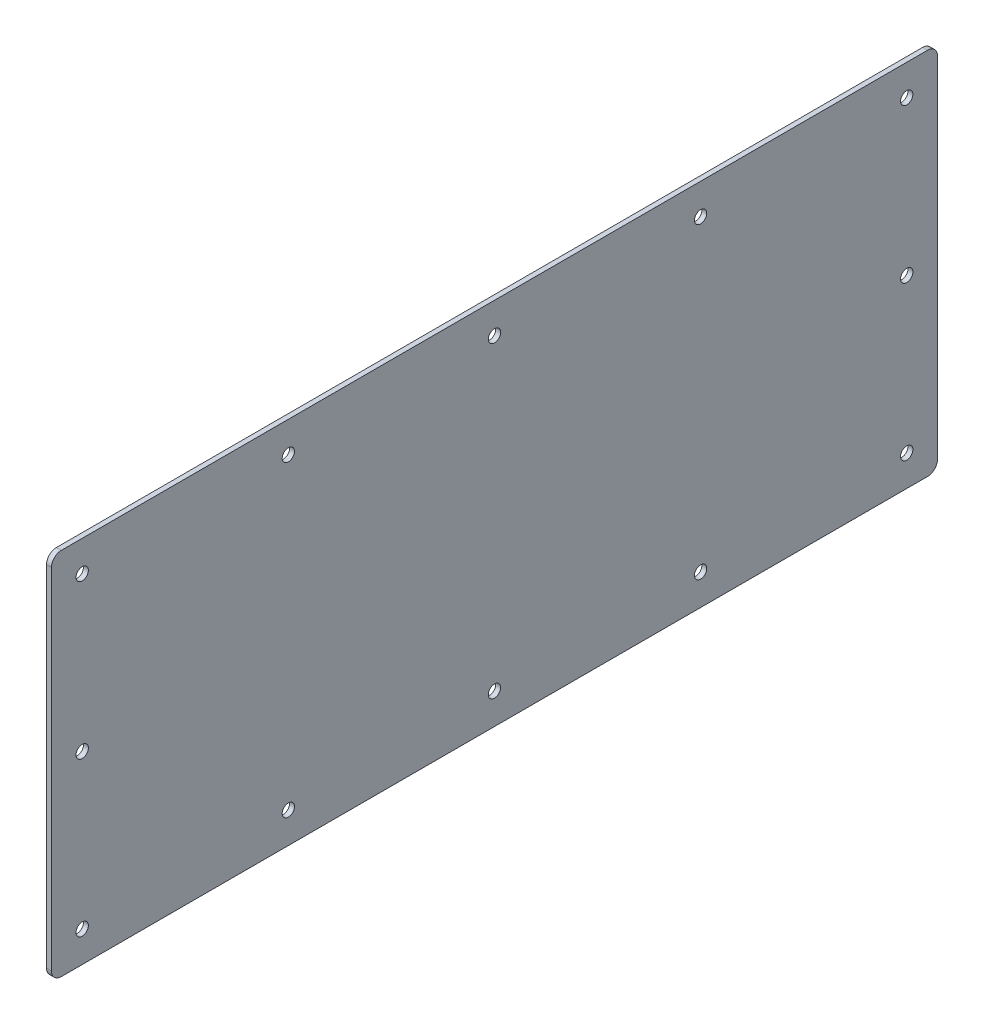
ISO-10303-21;
HEADER;
FILE_DESCRIPTION(('STEP AP214'),'2;1');
FILE_NAME('part.step','',(''),(''),'','','');
FILE_SCHEMA(('AUTOMOTIVE_DESIGN { 1 0 10303 214 1 1 1 1 }'));
ENDSEC;
DATA;
#1=APPLICATION_CONTEXT('core data for automotive mechanical design processes');
#2=APPLICATION_PROTOCOL_DEFINITION('international standard','automotive_design',2000,#1);
#3=PRODUCT_CONTEXT('',#1,'mechanical');
#4=PRODUCT('Part','Part','',(#3));
#5=PRODUCT_RELATED_PRODUCT_CATEGORY('part','',(#4));
#6=PRODUCT_DEFINITION_FORMATION('','',#4);
#7=PRODUCT_DEFINITION_CONTEXT('part definition',#1,'design');
#8=PRODUCT_DEFINITION('design','',#6,#7);
#9=PRODUCT_DEFINITION_SHAPE('','',#8);
#10=(LENGTH_UNIT() NAMED_UNIT(*) SI_UNIT(.MILLI.,.METRE.));
#11=(NAMED_UNIT(*) PLANE_ANGLE_UNIT() SI_UNIT($,.RADIAN.));
#12=(NAMED_UNIT(*) SI_UNIT($,.STERADIAN.) SOLID_ANGLE_UNIT());
#13=UNCERTAINTY_MEASURE_WITH_UNIT(LENGTH_MEASURE(1.E-05),#10,'distance_accuracy_value','');
#14=(GEOMETRIC_REPRESENTATION_CONTEXT(3) GLOBAL_UNCERTAINTY_ASSIGNED_CONTEXT((#13)) GLOBAL_UNIT_ASSIGNED_CONTEXT((#10,
#11,#12)) REPRESENTATION_CONTEXT('',''));
#15=CARTESIAN_POINT('',(0.,0.,0.));
#16=DIRECTION('',(0.,0.,1.));
#17=DIRECTION('',(1.,0.,0.));
#18=AXIS2_PLACEMENT_3D('',#15,#16,#17);
#19=CARTESIAN_POINT('',(2.54,95.25,-228.6));
#20=DIRECTION('',(0.,-1.,0.));
#21=DIRECTION('',(0.,0.,-1.));
#22=AXIS2_PLACEMENT_3D('',#19,#20,#21);
#23=PLANE('',#22);
#24=DIRECTION('',(0.,0.,1.));
#25=VECTOR('',#24,1.);
#26=CARTESIAN_POINT('',(2.54,95.25,-228.6));
#27=LINE('',#26,#25);
#28=CARTESIAN_POINT('',(2.54,95.25,-223.52));
#29=VERTEX_POINT('',#28);
#30=CARTESIAN_POINT('',(2.54,95.25,223.52));
#31=VERTEX_POINT('',#30);
#32=EDGE_CURVE('E132',#29,#31,#27,.T.);
#33=ORIENTED_EDGE('',*,*,#32,.F.);
#34=DIRECTION('',(-1.,0.,0.));
#35=VECTOR('',#34,1.);
#36=CARTESIAN_POINT('',(2.54,95.25,-223.52));
#37=LINE('',#36,#35);
#38=CARTESIAN_POINT('',(0.,95.25,-223.52));
#39=VERTEX_POINT('',#38);
#40=EDGE_CURVE('E117',#29,#39,#37,.T.);
#41=ORIENTED_EDGE('',*,*,#40,.T.);
#42=DIRECTION('',(0.,0.,1.));
#43=VECTOR('',#42,1.);
#44=CARTESIAN_POINT('',(0.,95.25,-228.6));
#45=LINE('',#44,#43);
#46=CARTESIAN_POINT('',(0.,95.25,223.52));
#47=VERTEX_POINT('',#46);
#48=EDGE_CURVE('E129',#39,#47,#45,.T.);
#49=ORIENTED_EDGE('',*,*,#48,.T.);
#50=DIRECTION('',(-1.,0.,0.));
#51=VECTOR('',#50,1.);
#52=CARTESIAN_POINT('',(2.54,95.25,223.52));
#53=LINE('',#52,#51);
#54=EDGE_CURVE('E134',#47,#31,#53,.F.);
#55=ORIENTED_EDGE('',*,*,#54,.T.);
#56=EDGE_LOOP('',(#33,#41,#49,#55));
#57=FACE_BOUND('',#56,.T.);
#58=ADVANCED_FACE('F45',(#57),#23,.F.);
#59=CARTESIAN_POINT('',(2.54,-95.25,228.6));
#60=DIRECTION('',(0.,0.,-1.));
#61=DIRECTION('',(-1.,0.,0.));
#62=AXIS2_PLACEMENT_3D('',#59,#60,#61);
#63=PLANE('',#62);
#64=DIRECTION('',(0.,-1.,0.));
#65=VECTOR('',#64,1.);
#66=CARTESIAN_POINT('',(0.,-95.25,228.6));
#67=LINE('',#66,#65);
#68=CARTESIAN_POINT('',(0.,90.17,228.6));
#69=VERTEX_POINT('',#68);
#70=CARTESIAN_POINT('',(0.,-90.17,228.6));
#71=VERTEX_POINT('',#70);
#72=EDGE_CURVE('E138',#69,#71,#67,.T.);
#73=ORIENTED_EDGE('',*,*,#72,.T.);
#74=DIRECTION('',(-1.,0.,0.));
#75=VECTOR('',#74,1.);
#76=CARTESIAN_POINT('',(2.54,-90.17,228.6));
#77=LINE('',#76,#75);
#78=CARTESIAN_POINT('',(2.54,-90.17,228.6));
#79=VERTEX_POINT('',#78);
#80=EDGE_CURVE('E11',#71,#79,#77,.F.);
#81=ORIENTED_EDGE('',*,*,#80,.T.);
#82=DIRECTION('',(0.,-1.,0.));
#83=VECTOR('',#82,1.);
#84=CARTESIAN_POINT('',(2.54,-95.25,228.6));
#85=LINE('',#84,#83);
#86=CARTESIAN_POINT('',(2.54,90.17,228.6));
#87=VERTEX_POINT('',#86);
#88=EDGE_CURVE('E278',#87,#79,#85,.T.);
#89=ORIENTED_EDGE('',*,*,#88,.F.);
#90=DIRECTION('',(-1.,0.,0.));
#91=VECTOR('',#90,1.);
#92=CARTESIAN_POINT('',(2.54,90.17,228.6));
#93=LINE('',#92,#91);
#94=EDGE_CURVE('E54',#87,#69,#93,.T.);
#95=ORIENTED_EDGE('',*,*,#94,.T.);
#96=EDGE_LOOP('',(#73,#81,#89,#95));
#97=FACE_BOUND('',#96,.T.);
#98=ADVANCED_FACE('F295',(#97),#63,.F.);
#99=CARTESIAN_POINT('',(2.54,-95.25,-228.6));
#100=DIRECTION('',(0.,1.,0.));
#101=DIRECTION('',(0.,0.,1.));
#102=AXIS2_PLACEMENT_3D('',#99,#100,#101);
#103=PLANE('',#102);
#104=DIRECTION('',(0.,0.,-1.));
#105=VECTOR('',#104,1.);
#106=CARTESIAN_POINT('',(0.,-95.25,-228.6));
#107=LINE('',#106,#105);
#108=CARTESIAN_POINT('',(0.,-95.25,223.52));
#109=VERTEX_POINT('',#108);
#110=CARTESIAN_POINT('',(0.,-95.25,-223.52));
#111=VERTEX_POINT('',#110);
#112=EDGE_CURVE('E141',#109,#111,#107,.T.);
#113=ORIENTED_EDGE('',*,*,#112,.T.);
#114=DIRECTION('',(-1.,0.,0.));
#115=VECTOR('',#114,1.);
#116=CARTESIAN_POINT('',(2.54,-95.25,-223.52));
#117=LINE('',#116,#115);
#118=CARTESIAN_POINT('',(2.54,-95.25,-223.52));
#119=VERTEX_POINT('',#118);
#120=EDGE_CURVE('E62',#111,#119,#117,.F.);
#121=ORIENTED_EDGE('',*,*,#120,.T.);
#122=DIRECTION('',(0.,0.,-1.));
#123=VECTOR('',#122,1.);
#124=CARTESIAN_POINT('',(2.54,-95.25,-228.6));
#125=LINE('',#124,#123);
#126=CARTESIAN_POINT('',(2.54,-95.25,223.52));
#127=VERTEX_POINT('',#126);
#128=EDGE_CURVE('E279',#127,#119,#125,.T.);
#129=ORIENTED_EDGE('',*,*,#128,.F.);
#130=DIRECTION('',(-1.,0.,0.));
#131=VECTOR('',#130,1.);
#132=CARTESIAN_POINT('',(2.54,-95.25,223.52));
#133=LINE('',#132,#131);
#134=EDGE_CURVE('E167',#127,#109,#133,.T.);
#135=ORIENTED_EDGE('',*,*,#134,.T.);
#136=EDGE_LOOP('',(#113,#121,#129,#135));
#137=FACE_BOUND('',#136,.T.);
#138=ADVANCED_FACE('F289',(#137),#103,.F.);
#139=CARTESIAN_POINT('',(2.54,-95.25,-228.6));
#140=DIRECTION('',(0.,0.,1.));
#141=DIRECTION('',(1.,0.,0.));
#142=AXIS2_PLACEMENT_3D('',#139,#140,#141);
#143=PLANE('',#142);
#144=DIRECTION('',(0.,1.,0.));
#145=VECTOR('',#144,1.);
#146=CARTESIAN_POINT('',(0.,-95.25,-228.6));
#147=LINE('',#146,#145);
#148=CARTESIAN_POINT('',(0.,-90.17,-228.6));
#149=VERTEX_POINT('',#148);
#150=CARTESIAN_POINT('',(0.,90.17,-228.6));
#151=VERTEX_POINT('',#150);
#152=EDGE_CURVE('E150',#149,#151,#147,.T.);
#153=ORIENTED_EDGE('',*,*,#152,.T.);
#154=DIRECTION('',(-1.,0.,0.));
#155=VECTOR('',#154,1.);
#156=CARTESIAN_POINT('',(2.54,90.17,-228.6));
#157=LINE('',#156,#155);
#158=CARTESIAN_POINT('',(2.54,90.17,-228.6));
#159=VERTEX_POINT('',#158);
#160=EDGE_CURVE('E118',#151,#159,#157,.F.);
#161=ORIENTED_EDGE('',*,*,#160,.T.);
#162=DIRECTION('',(0.,1.,0.));
#163=VECTOR('',#162,1.);
#164=CARTESIAN_POINT('',(2.54,-95.25,-228.6));
#165=LINE('',#164,#163);
#166=CARTESIAN_POINT('',(2.54,-90.17,-228.6));
#167=VERTEX_POINT('',#166);
#168=EDGE_CURVE('E146',#167,#159,#165,.T.);
#169=ORIENTED_EDGE('',*,*,#168,.F.);
#170=DIRECTION('',(-1.,0.,0.));
#171=VECTOR('',#170,1.);
#172=CARTESIAN_POINT('',(2.54,-90.17,-228.6));
#173=LINE('',#172,#171);
#174=EDGE_CURVE('E123',#167,#149,#173,.T.);
#175=ORIENTED_EDGE('',*,*,#174,.T.);
#176=EDGE_LOOP('',(#153,#161,#169,#175));
#177=FACE_BOUND('',#176,.T.);
#178=ADVANCED_FACE('F285',(#177),#143,.F.);
#179=CARTESIAN_POINT('',(2.54,0.,0.));
#180=DIRECTION('',(-1.,0.,0.));
#181=DIRECTION('',(0.,0.,1.));
#182=AXIS2_PLACEMENT_3D('',#179,#180,#181);
#183=PLANE('',#182);
#184=CARTESIAN_POINT('',(2.54,-1.66533453693773E-13,-212.725));
#185=DIRECTION('',(-1.,0.,0.));
#186=DIRECTION('',(0.,0.,1.));
#187=AXIS2_PLACEMENT_3D('',#184,#185,#186);
#188=CIRCLE('',#187,3.17499999999997);
#189=CARTESIAN_POINT('',(2.54,-1.66533453693773E-13,-209.55));
#190=VERTEX_POINT('',#189);
#191=EDGE_CURVE('E251',#190,#190,#188,.T.);
#192=ORIENTED_EDGE('',*,*,#191,.T.);
#193=EDGE_LOOP('',(#192));
#194=FACE_BOUND('',#193,.T.);
#195=CARTESIAN_POINT('',(2.54,79.3749999999998,-212.725));
#196=DIRECTION('',(-1.,0.,0.));
#197=DIRECTION('',(0.,0.,1.));
#198=AXIS2_PLACEMENT_3D('',#195,#196,#197);
#199=CIRCLE('',#198,3.17499999999997);
#200=CARTESIAN_POINT('',(2.54,79.3749999999998,-209.55));
#201=VERTEX_POINT('',#200);
#202=EDGE_CURVE('E252',#201,#201,#199,.T.);
#203=ORIENTED_EDGE('',*,*,#202,.T.);
#204=EDGE_LOOP('',(#203));
#205=FACE_BOUND('',#204,.T.);
#206=CARTESIAN_POINT('',(2.54,79.3749999999998,-106.3625));
#207=DIRECTION('',(-1.,0.,0.));
#208=DIRECTION('',(0.,0.,1.));
#209=AXIS2_PLACEMENT_3D('',#206,#207,#208);
#210=CIRCLE('',#209,3.17499999999998);
#211=CARTESIAN_POINT('',(2.54,79.3749999999998,-103.1875));
#212=VERTEX_POINT('',#211);
#213=EDGE_CURVE('E255',#212,#212,#210,.T.);
#214=ORIENTED_EDGE('',*,*,#213,.T.);
#215=EDGE_LOOP('',(#214));
#216=FACE_BOUND('',#215,.T.);
#217=CARTESIAN_POINT('',(2.54,79.3749999999998,106.3625));
#218=DIRECTION('',(-1.,0.,0.));
#219=DIRECTION('',(0.,0.,1.));
#220=AXIS2_PLACEMENT_3D('',#217,#218,#219);
#221=CIRCLE('',#220,3.17500000000001);
#222=CARTESIAN_POINT('',(2.54,79.3749999999998,109.5375));
#223=VERTEX_POINT('',#222);
#224=EDGE_CURVE('E243',#223,#223,#221,.T.);
#225=ORIENTED_EDGE('',*,*,#224,.T.);
#226=EDGE_LOOP('',(#225));
#227=FACE_BOUND('',#226,.T.);
#228=CARTESIAN_POINT('',(2.54,-79.3750000000001,-212.725));
#229=DIRECTION('',(-1.,0.,0.));
#230=DIRECTION('',(0.,0.,1.));
#231=AXIS2_PLACEMENT_3D('',#228,#229,#230);
#232=CIRCLE('',#231,3.17499999999997);
#233=CARTESIAN_POINT('',(2.54,-79.3750000000001,-209.55));
#234=VERTEX_POINT('',#233);
#235=EDGE_CURVE('E246',#234,#234,#232,.T.);
#236=ORIENTED_EDGE('',*,*,#235,.T.);
#237=EDGE_LOOP('',(#236));
#238=FACE_BOUND('',#237,.T.);
#239=CARTESIAN_POINT('',(2.54,-79.3750000000002,-106.3625));
#240=DIRECTION('',(-1.,0.,0.));
#241=DIRECTION('',(0.,0.,1.));
#242=AXIS2_PLACEMENT_3D('',#239,#240,#241);
#243=CIRCLE('',#242,3.17499999999998);
#244=CARTESIAN_POINT('',(2.54,-79.3750000000002,-103.1875));
#245=VERTEX_POINT('',#244);
#246=EDGE_CURVE('E177',#245,#245,#243,.T.);
#247=ORIENTED_EDGE('',*,*,#246,.T.);
#248=EDGE_LOOP('',(#247));
#249=FACE_BOUND('',#248,.T.);
#250=CARTESIAN_POINT('',(2.54,-79.3750000000002,1.11022302462516E-13));
#251=DIRECTION('',(-1.,0.,0.));
#252=DIRECTION('',(0.,0.,1.));
#253=AXIS2_PLACEMENT_3D('',#250,#251,#252);
#254=CIRCLE('',#253,3.175);
#255=CARTESIAN_POINT('',(2.54,-79.3750000000002,3.17500000000011));
#256=VERTEX_POINT('',#255);
#257=EDGE_CURVE('E269',#256,#256,#254,.T.);
#258=ORIENTED_EDGE('',*,*,#257,.T.);
#259=EDGE_LOOP('',(#258));
#260=FACE_BOUND('',#259,.T.);
#261=CARTESIAN_POINT('',(2.54,-79.3750000000002,106.3625));
#262=DIRECTION('',(-1.,0.,0.));
#263=DIRECTION('',(0.,0.,1.));
#264=AXIS2_PLACEMENT_3D('',#261,#262,#263);
#265=CIRCLE('',#264,3.17500000000001);
#266=CARTESIAN_POINT('',(2.54,-79.3750000000002,109.5375));
#267=VERTEX_POINT('',#266);
#268=EDGE_CURVE('E272',#267,#267,#265,.T.);
#269=ORIENTED_EDGE('',*,*,#268,.T.);
#270=EDGE_LOOP('',(#269));
#271=FACE_BOUND('',#270,.T.);
#272=CARTESIAN_POINT('',(2.54,-79.3750000000001,212.725));
#273=DIRECTION('',(-1.,0.,0.));
#274=DIRECTION('',(0.,0.,1.));
#275=AXIS2_PLACEMENT_3D('',#272,#273,#274);
#276=CIRCLE('',#275,3.17499999999997);
#277=CARTESIAN_POINT('',(2.54,-79.3750000000001,215.9));
#278=VERTEX_POINT('',#277);
#279=EDGE_CURVE('E264',#278,#278,#276,.T.);
#280=ORIENTED_EDGE('',*,*,#279,.T.);
#281=EDGE_LOOP('',(#280));
#282=FACE_BOUND('',#281,.T.);
#283=CARTESIAN_POINT('',(2.54,79.3749999999998,212.725));
#284=DIRECTION('',(-1.,0.,0.));
#285=DIRECTION('',(0.,0.,1.));
#286=AXIS2_PLACEMENT_3D('',#283,#284,#285);
#287=CIRCLE('',#286,3.17499999999997);
#288=CARTESIAN_POINT('',(2.54,79.3749999999998,215.9));
#289=VERTEX_POINT('',#288);
#290=EDGE_CURVE('E261',#289,#289,#287,.T.);
#291=ORIENTED_EDGE('',*,*,#290,.T.);
#292=EDGE_LOOP('',(#291));
#293=FACE_BOUND('',#292,.T.);
#294=CARTESIAN_POINT('',(2.54,-1.66533453693773E-13,212.725));
#295=DIRECTION('',(-1.,0.,0.));
#296=DIRECTION('',(0.,0.,1.));
#297=AXIS2_PLACEMENT_3D('',#294,#295,#296);
#298=CIRCLE('',#297,3.17499999999997);
#299=CARTESIAN_POINT('',(2.54,-1.66533453693773E-13,215.9));
#300=VERTEX_POINT('',#299);
#301=EDGE_CURVE('E260',#300,#300,#298,.T.);
#302=ORIENTED_EDGE('',*,*,#301,.T.);
#303=EDGE_LOOP('',(#302));
#304=FACE_BOUND('',#303,.T.);
#305=CARTESIAN_POINT('',(2.54,79.3749999999998,1.11022302462516E-13));
#306=DIRECTION('',(-1.,0.,0.));
#307=DIRECTION('',(0.,0.,1.));
#308=AXIS2_PLACEMENT_3D('',#305,#306,#307);
#309=CIRCLE('',#308,3.17500000000001);
#310=CARTESIAN_POINT('',(2.54,79.3749999999998,3.17500000000012));
#311=VERTEX_POINT('',#310);
#312=EDGE_CURVE('E241',#311,#311,#309,.T.);
#313=ORIENTED_EDGE('',*,*,#312,.T.);
#314=EDGE_LOOP('',(#313));
#315=FACE_BOUND('',#314,.T.);
#316=ORIENTED_EDGE('',*,*,#168,.T.);
#317=CARTESIAN_POINT('',(2.54,90.17,-223.52));
#318=DIRECTION('',(-1.,0.,0.));
#319=DIRECTION('',(0.,0.,1.));
#320=AXIS2_PLACEMENT_3D('',#317,#318,#319);
#321=CIRCLE('',#320,5.08);
#322=EDGE_CURVE('E165',#159,#29,#321,.F.);
#323=ORIENTED_EDGE('',*,*,#322,.T.);
#324=ORIENTED_EDGE('',*,*,#32,.T.);
#325=CARTESIAN_POINT('',(2.54,90.17,223.52));
#326=DIRECTION('',(-1.,0.,0.));
#327=DIRECTION('',(0.,0.,1.));
#328=AXIS2_PLACEMENT_3D('',#325,#326,#327);
#329=CIRCLE('',#328,5.08);
#330=EDGE_CURVE('E160',#31,#87,#329,.F.);
#331=ORIENTED_EDGE('',*,*,#330,.T.);
#332=ORIENTED_EDGE('',*,*,#88,.T.);
#333=CARTESIAN_POINT('',(2.54,-90.17,223.52));
#334=DIRECTION('',(-1.,0.,0.));
#335=DIRECTION('',(0.,0.,1.));
#336=AXIS2_PLACEMENT_3D('',#333,#334,#335);
#337=CIRCLE('',#336,5.08);
#338=EDGE_CURVE('E69',#79,#127,#337,.F.);
#339=ORIENTED_EDGE('',*,*,#338,.T.);
#340=ORIENTED_EDGE('',*,*,#128,.T.);
#341=CARTESIAN_POINT('',(2.54,-90.17,-223.52));
#342=DIRECTION('',(-1.,0.,0.));
#343=DIRECTION('',(0.,0.,1.));
#344=AXIS2_PLACEMENT_3D('',#341,#342,#343);
#345=CIRCLE('',#344,5.08);
#346=EDGE_CURVE('E163',#119,#167,#345,.F.);
#347=ORIENTED_EDGE('',*,*,#346,.T.);
#348=EDGE_LOOP('',(#316,#323,#324,#331,#332,#339,#340,#347));
#349=FACE_BOUND('',#348,.T.);
#350=ADVANCED_FACE('F211',(#194,#205,#216,#227,#238,#249,#260,#271,#282,#293,#304,#315,#349),
#183,.F.);
#351=CARTESIAN_POINT('',(0.,0.,0.));
#352=DIRECTION('',(-1.,0.,0.));
#353=DIRECTION('',(0.,0.,1.));
#354=AXIS2_PLACEMENT_3D('',#351,#352,#353);
#355=PLANE('',#354);
#356=CARTESIAN_POINT('',(0.,-1.66533453693773E-13,-212.725));
#357=DIRECTION('',(-1.,0.,0.));
#358=DIRECTION('',(0.,0.,1.));
#359=AXIS2_PLACEMENT_3D('',#356,#357,#358);
#360=CIRCLE('',#359,3.17499999999997);
#361=CARTESIAN_POINT('',(0.,-1.66533453693773E-13,-209.55));
#362=VERTEX_POINT('',#361);
#363=EDGE_CURVE('E49',#362,#362,#360,.T.);
#364=ORIENTED_EDGE('',*,*,#363,.F.);
#365=EDGE_LOOP('',(#364));
#366=FACE_BOUND('',#365,.T.);
#367=CARTESIAN_POINT('',(0.,79.3749999999998,-212.725));
#368=DIRECTION('',(-1.,0.,0.));
#369=DIRECTION('',(0.,0.,1.));
#370=AXIS2_PLACEMENT_3D('',#367,#368,#369);
#371=CIRCLE('',#370,3.17499999999997);
#372=CARTESIAN_POINT('',(0.,79.3749999999998,-209.55));
#373=VERTEX_POINT('',#372);
#374=EDGE_CURVE('E144',#373,#373,#371,.T.);
#375=ORIENTED_EDGE('',*,*,#374,.F.);
#376=EDGE_LOOP('',(#375));
#377=FACE_BOUND('',#376,.T.);
#378=CARTESIAN_POINT('',(0.,79.3749999999998,-106.3625));
#379=DIRECTION('',(-1.,0.,0.));
#380=DIRECTION('',(0.,0.,1.));
#381=AXIS2_PLACEMENT_3D('',#378,#379,#380);
#382=CIRCLE('',#381,3.17499999999998);
#383=CARTESIAN_POINT('',(0.,79.3749999999998,-103.1875));
#384=VERTEX_POINT('',#383);
#385=EDGE_CURVE('E201',#384,#384,#382,.T.);
#386=ORIENTED_EDGE('',*,*,#385,.F.);
#387=EDGE_LOOP('',(#386));
#388=FACE_BOUND('',#387,.T.);
#389=CARTESIAN_POINT('',(0.,79.3749999999998,106.3625));
#390=DIRECTION('',(-1.,0.,0.));
#391=DIRECTION('',(0.,0.,1.));
#392=AXIS2_PLACEMENT_3D('',#389,#390,#391);
#393=CIRCLE('',#392,3.17500000000001);
#394=CARTESIAN_POINT('',(0.,79.3749999999998,109.5375));
#395=VERTEX_POINT('',#394);
#396=EDGE_CURVE('E198',#395,#395,#393,.T.);
#397=ORIENTED_EDGE('',*,*,#396,.F.);
#398=EDGE_LOOP('',(#397));
#399=FACE_BOUND('',#398,.T.);
#400=CARTESIAN_POINT('',(0.,-79.3750000000001,-212.725));
#401=DIRECTION('',(-1.,0.,0.));
#402=DIRECTION('',(0.,0.,1.));
#403=AXIS2_PLACEMENT_3D('',#400,#401,#402);
#404=CIRCLE('',#403,3.17499999999997);
#405=CARTESIAN_POINT('',(0.,-79.3750000000001,-209.55));
#406=VERTEX_POINT('',#405);
#407=EDGE_CURVE('E195',#406,#406,#404,.T.);
#408=ORIENTED_EDGE('',*,*,#407,.F.);
#409=EDGE_LOOP('',(#408));
#410=FACE_BOUND('',#409,.T.);
#411=CARTESIAN_POINT('',(0.,-79.3750000000002,-106.3625));
#412=DIRECTION('',(-1.,0.,0.));
#413=DIRECTION('',(0.,0.,1.));
#414=AXIS2_PLACEMENT_3D('',#411,#412,#413);
#415=CIRCLE('',#414,3.17499999999998);
#416=CARTESIAN_POINT('',(0.,-79.3750000000002,-103.1875));
#417=VERTEX_POINT('',#416);
#418=EDGE_CURVE('E192',#417,#417,#415,.T.);
#419=ORIENTED_EDGE('',*,*,#418,.F.);
#420=EDGE_LOOP('',(#419));
#421=FACE_BOUND('',#420,.T.);
#422=CARTESIAN_POINT('',(0.,-79.3750000000002,1.11022302462516E-13));
#423=DIRECTION('',(-1.,0.,0.));
#424=DIRECTION('',(0.,0.,1.));
#425=AXIS2_PLACEMENT_3D('',#422,#423,#424);
#426=CIRCLE('',#425,3.175);
#427=CARTESIAN_POINT('',(0.,-79.3750000000002,3.17500000000011));
#428=VERTEX_POINT('',#427);
#429=EDGE_CURVE('E189',#428,#428,#426,.T.);
#430=ORIENTED_EDGE('',*,*,#429,.F.);
#431=EDGE_LOOP('',(#430));
#432=FACE_BOUND('',#431,.T.);
#433=CARTESIAN_POINT('',(0.,-79.3750000000002,106.3625));
#434=DIRECTION('',(-1.,0.,0.));
#435=DIRECTION('',(0.,0.,1.));
#436=AXIS2_PLACEMENT_3D('',#433,#434,#435);
#437=CIRCLE('',#436,3.17500000000001);
#438=CARTESIAN_POINT('',(0.,-79.3750000000002,109.5375));
#439=VERTEX_POINT('',#438);
#440=EDGE_CURVE('E186',#439,#439,#437,.T.);
#441=ORIENTED_EDGE('',*,*,#440,.F.);
#442=EDGE_LOOP('',(#441));
#443=FACE_BOUND('',#442,.T.);
#444=CARTESIAN_POINT('',(0.,-79.3750000000001,212.725));
#445=DIRECTION('',(-1.,0.,0.));
#446=DIRECTION('',(0.,0.,1.));
#447=AXIS2_PLACEMENT_3D('',#444,#445,#446);
#448=CIRCLE('',#447,3.17499999999997);
#449=CARTESIAN_POINT('',(0.,-79.3750000000001,215.9));
#450=VERTEX_POINT('',#449);
#451=EDGE_CURVE('E183',#450,#450,#448,.T.);
#452=ORIENTED_EDGE('',*,*,#451,.F.);
#453=EDGE_LOOP('',(#452));
#454=FACE_BOUND('',#453,.T.);
#455=CARTESIAN_POINT('',(0.,79.3749999999998,212.725));
#456=DIRECTION('',(-1.,0.,0.));
#457=DIRECTION('',(0.,0.,1.));
#458=AXIS2_PLACEMENT_3D('',#455,#456,#457);
#459=CIRCLE('',#458,3.17499999999997);
#460=CARTESIAN_POINT('',(0.,79.3749999999998,215.9));
#461=VERTEX_POINT('',#460);
#462=EDGE_CURVE('E180',#461,#461,#459,.T.);
#463=ORIENTED_EDGE('',*,*,#462,.F.);
#464=EDGE_LOOP('',(#463));
#465=FACE_BOUND('',#464,.T.);
#466=CARTESIAN_POINT('',(0.,-1.66533453693773E-13,212.725));
#467=DIRECTION('',(-1.,0.,0.));
#468=DIRECTION('',(0.,0.,1.));
#469=AXIS2_PLACEMENT_3D('',#466,#467,#468);
#470=CIRCLE('',#469,3.17499999999997);
#471=CARTESIAN_POINT('',(0.,-1.66533453693773E-13,215.9));
#472=VERTEX_POINT('',#471);
#473=EDGE_CURVE('E176',#472,#472,#470,.T.);
#474=ORIENTED_EDGE('',*,*,#473,.F.);
#475=EDGE_LOOP('',(#474));
#476=FACE_BOUND('',#475,.T.);
#477=CARTESIAN_POINT('',(0.,79.3749999999998,1.11022302462516E-13));
#478=DIRECTION('',(-1.,0.,0.));
#479=DIRECTION('',(0.,0.,1.));
#480=AXIS2_PLACEMENT_3D('',#477,#478,#479);
#481=CIRCLE('',#480,3.17500000000001);
#482=CARTESIAN_POINT('',(0.,79.3749999999998,3.17500000000012));
#483=VERTEX_POINT('',#482);
#484=EDGE_CURVE('E173',#483,#483,#481,.T.);
#485=ORIENTED_EDGE('',*,*,#484,.F.);
#486=EDGE_LOOP('',(#485));
#487=FACE_BOUND('',#486,.T.);
#488=ORIENTED_EDGE('',*,*,#48,.F.);
#489=CARTESIAN_POINT('',(0.,90.17,-223.52));
#490=DIRECTION('',(-1.,0.,0.));
#491=DIRECTION('',(0.,0.,1.));
#492=AXIS2_PLACEMENT_3D('',#489,#490,#491);
#493=CIRCLE('',#492,5.08);
#494=EDGE_CURVE('E113',#39,#151,#493,.T.);
#495=ORIENTED_EDGE('',*,*,#494,.T.);
#496=ORIENTED_EDGE('',*,*,#152,.F.);
#497=CARTESIAN_POINT('',(0.,-90.17,-223.52));
#498=DIRECTION('',(-1.,0.,0.));
#499=DIRECTION('',(0.,0.,1.));
#500=AXIS2_PLACEMENT_3D('',#497,#498,#499);
#501=CIRCLE('',#500,5.08);
#502=EDGE_CURVE('E124',#149,#111,#501,.T.);
#503=ORIENTED_EDGE('',*,*,#502,.T.);
#504=ORIENTED_EDGE('',*,*,#112,.F.);
#505=CARTESIAN_POINT('',(0.,-90.17,223.52));
#506=DIRECTION('',(-1.,0.,0.));
#507=DIRECTION('',(0.,0.,1.));
#508=AXIS2_PLACEMENT_3D('',#505,#506,#507);
#509=CIRCLE('',#508,5.08);
#510=EDGE_CURVE('E154',#109,#71,#509,.T.);
#511=ORIENTED_EDGE('',*,*,#510,.T.);
#512=ORIENTED_EDGE('',*,*,#72,.F.);
#513=CARTESIAN_POINT('',(0.,90.17,223.52));
#514=DIRECTION('',(-1.,0.,0.));
#515=DIRECTION('',(0.,0.,1.));
#516=AXIS2_PLACEMENT_3D('',#513,#514,#515);
#517=CIRCLE('',#516,5.08);
#518=EDGE_CURVE('E133',#69,#47,#517,.T.);
#519=ORIENTED_EDGE('',*,*,#518,.T.);
#520=EDGE_LOOP('',(#488,#495,#496,#503,#504,#511,#512,#519));
#521=FACE_BOUND('',#520,.T.);
#522=ADVANCED_FACE('F136',(#366,#377,#388,#399,#410,#421,#432,#443,#454,#465,#476,#487,#521),
#355,.T.);
#523=CARTESIAN_POINT('',(2.54,90.17,-223.52));
#524=DIRECTION('',(-1.,0.,0.));
#525=DIRECTION('',(0.,0.,1.));
#526=AXIS2_PLACEMENT_3D('',#523,#524,#525);
#527=CYLINDRICAL_SURFACE('',#526,5.08);
#528=ORIENTED_EDGE('',*,*,#322,.F.);
#529=ORIENTED_EDGE('',*,*,#160,.F.);
#530=ORIENTED_EDGE('',*,*,#494,.F.);
#531=ORIENTED_EDGE('',*,*,#40,.F.);
#532=EDGE_LOOP('',(#528,#529,#530,#531));
#533=FACE_BOUND('',#532,.T.);
#534=ADVANCED_FACE('F116',(#533),#527,.T.);
#535=CARTESIAN_POINT('',(2.54,-90.17,-223.52));
#536=DIRECTION('',(-1.,0.,0.));
#537=DIRECTION('',(0.,0.,1.));
#538=AXIS2_PLACEMENT_3D('',#535,#536,#537);
#539=CYLINDRICAL_SURFACE('',#538,5.08);
#540=ORIENTED_EDGE('',*,*,#346,.F.);
#541=ORIENTED_EDGE('',*,*,#120,.F.);
#542=ORIENTED_EDGE('',*,*,#502,.F.);
#543=ORIENTED_EDGE('',*,*,#174,.F.);
#544=EDGE_LOOP('',(#540,#541,#542,#543));
#545=FACE_BOUND('',#544,.T.);
#546=ADVANCED_FACE('F287',(#545),#539,.T.);
#547=CARTESIAN_POINT('',(2.54,-90.17,223.52));
#548=DIRECTION('',(-1.,0.,0.));
#549=DIRECTION('',(0.,0.,1.));
#550=AXIS2_PLACEMENT_3D('',#547,#548,#549);
#551=CYLINDRICAL_SURFACE('',#550,5.08);
#552=ORIENTED_EDGE('',*,*,#338,.F.);
#553=ORIENTED_EDGE('',*,*,#80,.F.);
#554=ORIENTED_EDGE('',*,*,#510,.F.);
#555=ORIENTED_EDGE('',*,*,#134,.F.);
#556=EDGE_LOOP('',(#552,#553,#554,#555));
#557=FACE_BOUND('',#556,.T.);
#558=ADVANCED_FACE('F292',(#557),#551,.T.);
#559=CARTESIAN_POINT('',(2.54,90.17,223.52));
#560=DIRECTION('',(-1.,0.,0.));
#561=DIRECTION('',(0.,0.,1.));
#562=AXIS2_PLACEMENT_3D('',#559,#560,#561);
#563=CYLINDRICAL_SURFACE('',#562,5.08);
#564=ORIENTED_EDGE('',*,*,#330,.F.);
#565=ORIENTED_EDGE('',*,*,#54,.F.);
#566=ORIENTED_EDGE('',*,*,#518,.F.);
#567=ORIENTED_EDGE('',*,*,#94,.F.);
#568=EDGE_LOOP('',(#564,#565,#566,#567));
#569=FACE_BOUND('',#568,.T.);
#570=ADVANCED_FACE('F47',(#569),#563,.T.);
#571=CARTESIAN_POINT('',(2.54,79.3749999999998,1.11022302462516E-13));
#572=DIRECTION('',(-1.,0.,0.));
#573=DIRECTION('',(0.,0.,1.));
#574=AXIS2_PLACEMENT_3D('',#571,#572,#573);
#575=CYLINDRICAL_SURFACE('',#574,3.17500000000001);
#576=ORIENTED_EDGE('',*,*,#484,.T.);
#577=EDGE_LOOP('',(#576));
#578=FACE_BOUND('',#577,.T.);
#579=ORIENTED_EDGE('',*,*,#312,.F.);
#580=EDGE_LOOP('',(#579));
#581=FACE_BOUND('',#580,.T.);
#582=ADVANCED_FACE('F234',(#578,#581),#575,.F.);
#583=CARTESIAN_POINT('',(2.54,-1.66533453693773E-13,212.725));
#584=DIRECTION('',(-1.,0.,0.));
#585=DIRECTION('',(0.,0.,1.));
#586=AXIS2_PLACEMENT_3D('',#583,#584,#585);
#587=CYLINDRICAL_SURFACE('',#586,3.17499999999997);
#588=ORIENTED_EDGE('',*,*,#473,.T.);
#589=EDGE_LOOP('',(#588));
#590=FACE_BOUND('',#589,.T.);
#591=ORIENTED_EDGE('',*,*,#301,.F.);
#592=EDGE_LOOP('',(#591));
#593=FACE_BOUND('',#592,.T.);
#594=ADVANCED_FACE('F237',(#590,#593),#587,.F.);
#595=CARTESIAN_POINT('',(2.54,79.3749999999998,212.725));
#596=DIRECTION('',(-1.,0.,0.));
#597=DIRECTION('',(0.,0.,1.));
#598=AXIS2_PLACEMENT_3D('',#595,#596,#597);
#599=CYLINDRICAL_SURFACE('',#598,3.17499999999997);
#600=ORIENTED_EDGE('',*,*,#462,.T.);
#601=EDGE_LOOP('',(#600));
#602=FACE_BOUND('',#601,.T.);
#603=ORIENTED_EDGE('',*,*,#290,.F.);
#604=EDGE_LOOP('',(#603));
#605=FACE_BOUND('',#604,.T.);
#606=ADVANCED_FACE('F346',(#602,#605),#599,.F.);
#607=CARTESIAN_POINT('',(2.54,-79.3750000000001,212.725));
#608=DIRECTION('',(-1.,0.,0.));
#609=DIRECTION('',(0.,0.,1.));
#610=AXIS2_PLACEMENT_3D('',#607,#608,#609);
#611=CYLINDRICAL_SURFACE('',#610,3.17499999999997);
#612=ORIENTED_EDGE('',*,*,#451,.T.);
#613=EDGE_LOOP('',(#612));
#614=FACE_BOUND('',#613,.T.);
#615=ORIENTED_EDGE('',*,*,#279,.F.);
#616=EDGE_LOOP('',(#615));
#617=FACE_BOUND('',#616,.T.);
#618=ADVANCED_FACE('F356',(#614,#617),#611,.F.);
#619=CARTESIAN_POINT('',(2.54,-79.3750000000002,106.3625));
#620=DIRECTION('',(-1.,0.,0.));
#621=DIRECTION('',(0.,0.,1.));
#622=AXIS2_PLACEMENT_3D('',#619,#620,#621);
#623=CYLINDRICAL_SURFACE('',#622,3.17500000000001);
#624=ORIENTED_EDGE('',*,*,#440,.T.);
#625=EDGE_LOOP('',(#624));
#626=FACE_BOUND('',#625,.T.);
#627=ORIENTED_EDGE('',*,*,#268,.F.);
#628=EDGE_LOOP('',(#627));
#629=FACE_BOUND('',#628,.T.);
#630=ADVANCED_FACE('F366',(#626,#629),#623,.F.);
#631=CARTESIAN_POINT('',(2.54,-79.3750000000002,1.11022302462516E-13));
#632=DIRECTION('',(-1.,0.,0.));
#633=DIRECTION('',(0.,0.,1.));
#634=AXIS2_PLACEMENT_3D('',#631,#632,#633);
#635=CYLINDRICAL_SURFACE('',#634,3.175);
#636=ORIENTED_EDGE('',*,*,#429,.T.);
#637=EDGE_LOOP('',(#636));
#638=FACE_BOUND('',#637,.T.);
#639=ORIENTED_EDGE('',*,*,#257,.F.);
#640=EDGE_LOOP('',(#639));
#641=FACE_BOUND('',#640,.T.);
#642=ADVANCED_FACE('F376',(#638,#641),#635,.F.);
#643=CARTESIAN_POINT('',(2.54,-79.3750000000002,-106.3625));
#644=DIRECTION('',(-1.,0.,0.));
#645=DIRECTION('',(0.,0.,1.));
#646=AXIS2_PLACEMENT_3D('',#643,#644,#645);
#647=CYLINDRICAL_SURFACE('',#646,3.17499999999998);
#648=ORIENTED_EDGE('',*,*,#418,.T.);
#649=EDGE_LOOP('',(#648));
#650=FACE_BOUND('',#649,.T.);
#651=ORIENTED_EDGE('',*,*,#246,.F.);
#652=EDGE_LOOP('',(#651));
#653=FACE_BOUND('',#652,.T.);
#654=ADVANCED_FACE('F386',(#650,#653),#647,.F.);
#655=CARTESIAN_POINT('',(2.54,-79.3750000000001,-212.725));
#656=DIRECTION('',(-1.,0.,0.));
#657=DIRECTION('',(0.,0.,1.));
#658=AXIS2_PLACEMENT_3D('',#655,#656,#657);
#659=CYLINDRICAL_SURFACE('',#658,3.17499999999997);
#660=ORIENTED_EDGE('',*,*,#407,.T.);
#661=EDGE_LOOP('',(#660));
#662=FACE_BOUND('',#661,.T.);
#663=ORIENTED_EDGE('',*,*,#235,.F.);
#664=EDGE_LOOP('',(#663));
#665=FACE_BOUND('',#664,.T.);
#666=ADVANCED_FACE('F396',(#662,#665),#659,.F.);
#667=CARTESIAN_POINT('',(2.54,79.3749999999998,106.3625));
#668=DIRECTION('',(-1.,0.,0.));
#669=DIRECTION('',(0.,0.,1.));
#670=AXIS2_PLACEMENT_3D('',#667,#668,#669);
#671=CYLINDRICAL_SURFACE('',#670,3.17500000000001);
#672=ORIENTED_EDGE('',*,*,#396,.T.);
#673=EDGE_LOOP('',(#672));
#674=FACE_BOUND('',#673,.T.);
#675=ORIENTED_EDGE('',*,*,#224,.F.);
#676=EDGE_LOOP('',(#675));
#677=FACE_BOUND('',#676,.T.);
#678=ADVANCED_FACE('F406',(#674,#677),#671,.F.);
#679=CARTESIAN_POINT('',(2.54,79.3749999999998,-106.3625));
#680=DIRECTION('',(-1.,0.,0.));
#681=DIRECTION('',(0.,0.,1.));
#682=AXIS2_PLACEMENT_3D('',#679,#680,#681);
#683=CYLINDRICAL_SURFACE('',#682,3.17499999999998);
#684=ORIENTED_EDGE('',*,*,#385,.T.);
#685=EDGE_LOOP('',(#684));
#686=FACE_BOUND('',#685,.T.);
#687=ORIENTED_EDGE('',*,*,#213,.F.);
#688=EDGE_LOOP('',(#687));
#689=FACE_BOUND('',#688,.T.);
#690=ADVANCED_FACE('F416',(#686,#689),#683,.F.);
#691=CARTESIAN_POINT('',(2.54,79.3749999999998,-212.725));
#692=DIRECTION('',(-1.,0.,0.));
#693=DIRECTION('',(0.,0.,1.));
#694=AXIS2_PLACEMENT_3D('',#691,#692,#693);
#695=CYLINDRICAL_SURFACE('',#694,3.17499999999997);
#696=ORIENTED_EDGE('',*,*,#374,.T.);
#697=EDGE_LOOP('',(#696));
#698=FACE_BOUND('',#697,.T.);
#699=ORIENTED_EDGE('',*,*,#202,.F.);
#700=EDGE_LOOP('',(#699));
#701=FACE_BOUND('',#700,.T.);
#702=ADVANCED_FACE('F206',(#698,#701),#695,.F.);
#703=CARTESIAN_POINT('',(2.54,-1.66533453693773E-13,-212.725));
#704=DIRECTION('',(-1.,0.,0.));
#705=DIRECTION('',(0.,0.,1.));
#706=AXIS2_PLACEMENT_3D('',#703,#704,#705);
#707=CYLINDRICAL_SURFACE('',#706,3.17499999999997);
#708=ORIENTED_EDGE('',*,*,#363,.T.);
#709=EDGE_LOOP('',(#708));
#710=FACE_BOUND('',#709,.T.);
#711=ORIENTED_EDGE('',*,*,#191,.F.);
#712=EDGE_LOOP('',(#711));
#713=FACE_BOUND('',#712,.T.);
#714=ADVANCED_FACE('F435',(#710,#713),#707,.F.);
#715=CLOSED_SHELL('',(#58,#98,#138,#178,#350,#522,#534,#546,#558,#570,#582,#594,#606,#618,#630,
#642,#654,#666,#678,#690,#702,#714));
#716=MANIFOLD_SOLID_BREP('B2',#715);
#717=ADVANCED_BREP_SHAPE_REPRESENTATION('',(#18,#716),#14);
#718=SHAPE_DEFINITION_REPRESENTATION(#9,#717);
ENDSEC;
END-ISO-10303-21;
